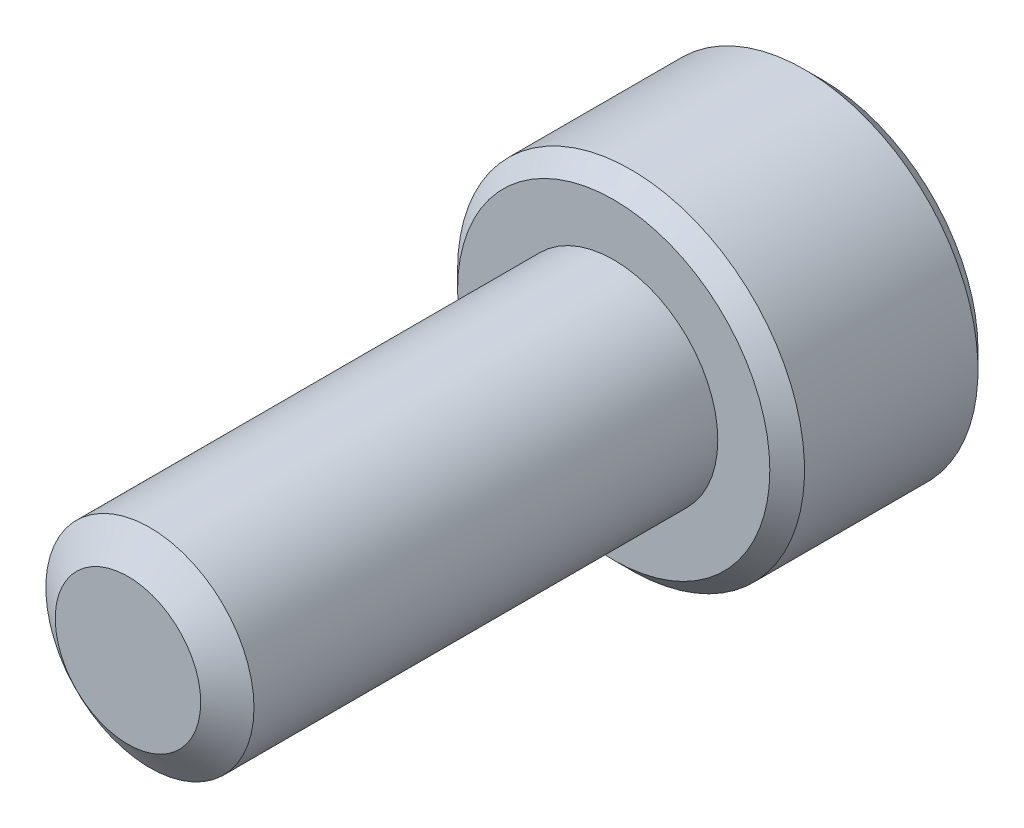
ISO-10303-21;
HEADER;
FILE_DESCRIPTION(('STEP AP214'),'2;1');
FILE_NAME('part.step','',(''),(''),'','','');
FILE_SCHEMA(('AUTOMOTIVE_DESIGN { 1 0 10303 214 1 1 1 1 }'));
ENDSEC;
DATA;
#1=APPLICATION_CONTEXT('core data for automotive mechanical design processes');
#2=APPLICATION_PROTOCOL_DEFINITION('international standard','automotive_design',2000,#1);
#3=PRODUCT_CONTEXT('',#1,'mechanical');
#4=PRODUCT('Part','Part','',(#3));
#5=PRODUCT_RELATED_PRODUCT_CATEGORY('part','',(#4));
#6=PRODUCT_DEFINITION_FORMATION('','',#4);
#7=PRODUCT_DEFINITION_CONTEXT('part definition',#1,'design');
#8=PRODUCT_DEFINITION('design','',#6,#7);
#9=PRODUCT_DEFINITION_SHAPE('','',#8);
#10=(LENGTH_UNIT() NAMED_UNIT(*) SI_UNIT(.MILLI.,.METRE.));
#11=(NAMED_UNIT(*) PLANE_ANGLE_UNIT() SI_UNIT($,.RADIAN.));
#12=(NAMED_UNIT(*) SI_UNIT($,.STERADIAN.) SOLID_ANGLE_UNIT());
#13=UNCERTAINTY_MEASURE_WITH_UNIT(LENGTH_MEASURE(1.E-05),#10,'distance_accuracy_value','');
#14=(GEOMETRIC_REPRESENTATION_CONTEXT(3) GLOBAL_UNCERTAINTY_ASSIGNED_CONTEXT((#13)) GLOBAL_UNIT_ASSIGNED_CONTEXT((#10,
#11,#12)) REPRESENTATION_CONTEXT('',''));
#15=CARTESIAN_POINT('',(0.,0.,0.));
#16=DIRECTION('',(0.,0.,1.));
#17=DIRECTION('',(1.,0.,0.));
#18=AXIS2_PLACEMENT_3D('',#15,#16,#17);
#19=CARTESIAN_POINT('',(0.,0.,-14.));
#20=DIRECTION('',(0.,0.,1.));
#21=DIRECTION('',(1.,0.,0.));
#22=AXIS2_PLACEMENT_3D('',#19,#20,#21);
#23=CYLINDRICAL_SURFACE('',#22,3.);
#24=CARTESIAN_POINT('',(0.,0.,-14.));
#25=DIRECTION('',(0.,0.,-1.));
#26=DIRECTION('',(-1.,0.,0.));
#27=AXIS2_PLACEMENT_3D('',#24,#25,#26);
#28=CIRCLE('',#27,3.);
#29=CARTESIAN_POINT('',(-3.,0.,-14.));
#30=VERTEX_POINT('',#29);
#31=EDGE_CURVE('E231',#30,#30,#28,.F.);
#32=ORIENTED_EDGE('',*,*,#31,.T.);
#33=EDGE_LOOP('',(#32));
#34=FACE_BOUND('',#33,.T.);
#35=CARTESIAN_POINT('',(0.,0.,-0.632650851713494));
#36=DIRECTION('',(0.,0.,1.));
#37=DIRECTION('',(1.,0.,0.));
#38=AXIS2_PLACEMENT_3D('',#35,#36,#37);
#39=CIRCLE('',#38,3.);
#40=CARTESIAN_POINT('',(3.,0.,-0.632650851713494));
#41=VERTEX_POINT('',#40);
#42=EDGE_CURVE('E116',#41,#41,#39,.T.);
#43=ORIENTED_EDGE('',*,*,#42,.F.);
#44=EDGE_LOOP('',(#43));
#45=FACE_BOUND('',#44,.T.);
#46=ADVANCED_FACE('F39',(#34,#45),#23,.T.);
#47=CARTESIAN_POINT('',(0.,0.,0.));
#48=DIRECTION('',(0.,0.,-1.));
#49=DIRECTION('',(-1.,0.,0.));
#50=AXIS2_PLACEMENT_3D('',#47,#48,#49);
#51=CONICAL_SURFACE('',#50,2.09648094716167,0.959931088596884);
#52=ORIENTED_EDGE('',*,*,#42,.T.);
#53=EDGE_LOOP('',(#52));
#54=FACE_BOUND('',#53,.T.);
#55=CARTESIAN_POINT('',(0.,0.,0.));
#56=DIRECTION('',(0.,0.,1.));
#57=DIRECTION('',(1.,0.,0.));
#58=AXIS2_PLACEMENT_3D('',#55,#56,#57);
#59=CIRCLE('',#58,2.09648094716167);
#60=CARTESIAN_POINT('',(2.09648094716167,0.,0.));
#61=VERTEX_POINT('',#60);
#62=EDGE_CURVE('E228',#61,#61,#59,.T.);
#63=ORIENTED_EDGE('',*,*,#62,.F.);
#64=EDGE_LOOP('',(#63));
#65=FACE_BOUND('',#64,.T.);
#66=ADVANCED_FACE('F211',(#54,#65),#51,.T.);
#67=CARTESIAN_POINT('',(0.,0.,0.));
#68=DIRECTION('',(0.,0.,1.));
#69=DIRECTION('',(1.,0.,0.));
#70=AXIS2_PLACEMENT_3D('',#67,#68,#69);
#71=PLANE('',#70);
#72=ORIENTED_EDGE('',*,*,#62,.T.);
#73=EDGE_LOOP('',(#72));
#74=FACE_BOUND('',#73,.T.);
#75=ADVANCED_FACE('F208',(#74),#71,.T.);
#76=CARTESIAN_POINT('',(0.,0.,-20.));
#77=DIRECTION('',(0.,0.,1.));
#78=DIRECTION('',(1.,0.,0.));
#79=AXIS2_PLACEMENT_3D('',#76,#77,#78);
#80=CYLINDRICAL_SURFACE('',#79,5.);
#81=CARTESIAN_POINT('',(0.,0.,-19.5));
#82=DIRECTION('',(0.,0.,-1.));
#83=DIRECTION('',(-1.,0.,0.));
#84=AXIS2_PLACEMENT_3D('',#81,#82,#83);
#85=CIRCLE('',#84,5.);
#86=CARTESIAN_POINT('',(-5.,0.,-19.5));
#87=VERTEX_POINT('',#86);
#88=EDGE_CURVE('E48',#87,#87,#85,.F.);
#89=ORIENTED_EDGE('',*,*,#88,.T.);
#90=EDGE_LOOP('',(#89));
#91=FACE_BOUND('',#90,.T.);
#92=CARTESIAN_POINT('',(0.,0.,-14.5));
#93=DIRECTION('',(0.,0.,-1.));
#94=DIRECTION('',(-1.,0.,0.));
#95=AXIS2_PLACEMENT_3D('',#92,#93,#94);
#96=CIRCLE('',#95,5.);
#97=CARTESIAN_POINT('',(-5.,0.,-14.5));
#98=VERTEX_POINT('',#97);
#99=EDGE_CURVE('E185',#98,#98,#96,.T.);
#100=ORIENTED_EDGE('',*,*,#99,.T.);
#101=EDGE_LOOP('',(#100));
#102=FACE_BOUND('',#101,.T.);
#103=ADVANCED_FACE('F192',(#91,#102),#80,.T.);
#104=CARTESIAN_POINT('',(0.,0.,-20.));
#105=DIRECTION('',(0.,0.,-1.));
#106=DIRECTION('',(-1.,0.,0.));
#107=AXIS2_PLACEMENT_3D('',#104,#105,#106);
#108=PLANE('',#107);
#109=CARTESIAN_POINT('',(0.,0.,-20.));
#110=DIRECTION('',(0.,0.,-1.));
#111=DIRECTION('',(-1.,0.,0.));
#112=AXIS2_PLACEMENT_3D('',#109,#110,#111);
#113=CIRCLE('',#112,4.5);
#114=CARTESIAN_POINT('',(-4.5,0.,-20.));
#115=VERTEX_POINT('',#114);
#116=EDGE_CURVE('E115',#115,#115,#113,.T.);
#117=ORIENTED_EDGE('',*,*,#116,.T.);
#118=EDGE_LOOP('',(#117));
#119=FACE_BOUND('',#118,.T.);
#120=CARTESIAN_POINT('',(0.,0.,-20.));
#121=DIRECTION('',(0.,0.,-1.));
#122=DIRECTION('',(-1.,0.,0.));
#123=AXIS2_PLACEMENT_3D('',#120,#121,#122);
#124=CIRCLE('',#123,2.88675134594813);
#125=CARTESIAN_POINT('',(-2.5,1.44337567297406,-20.));
#126=VERTEX_POINT('',#125);
#127=CARTESIAN_POINT('',(0.,2.88675134594813,-20.));
#128=VERTEX_POINT('',#127);
#129=EDGE_CURVE('E94',#126,#128,#124,.T.);
#130=ORIENTED_EDGE('',*,*,#129,.F.);
#131=CARTESIAN_POINT('',(-2.5,-1.44337567297406,-20.));
#132=VERTEX_POINT('',#131);
#133=EDGE_CURVE('E54',#132,#126,#124,.T.);
#134=ORIENTED_EDGE('',*,*,#133,.F.);
#135=CARTESIAN_POINT('',(0.,-2.88675134594813,-20.));
#136=VERTEX_POINT('',#135);
#137=EDGE_CURVE('E304',#136,#132,#124,.T.);
#138=ORIENTED_EDGE('',*,*,#137,.F.);
#139=CARTESIAN_POINT('',(2.5,-1.44337567297406,-20.));
#140=VERTEX_POINT('',#139);
#141=EDGE_CURVE('E61',#140,#136,#124,.T.);
#142=ORIENTED_EDGE('',*,*,#141,.F.);
#143=CARTESIAN_POINT('',(2.5,1.44337567297407,-20.));
#144=VERTEX_POINT('',#143);
#145=EDGE_CURVE('E139',#144,#140,#124,.T.);
#146=ORIENTED_EDGE('',*,*,#145,.F.);
#147=EDGE_CURVE('E104',#128,#144,#124,.T.);
#148=ORIENTED_EDGE('',*,*,#147,.F.);
#149=EDGE_LOOP('',(#130,#134,#138,#142,#146,#148));
#150=FACE_BOUND('',#149,.T.);
#151=ADVANCED_FACE('F138',(#119,#150),#108,.T.);
#152=CARTESIAN_POINT('',(0.,0.,-14.));
#153=DIRECTION('',(0.,0.,-1.));
#154=DIRECTION('',(-1.,0.,0.));
#155=AXIS2_PLACEMENT_3D('',#152,#153,#154);
#156=PLANE('',#155);
#157=CARTESIAN_POINT('',(0.,0.,-14.));
#158=DIRECTION('',(0.,0.,-1.));
#159=DIRECTION('',(-1.,0.,0.));
#160=AXIS2_PLACEMENT_3D('',#157,#158,#159);
#161=CIRCLE('',#160,4.5);
#162=CARTESIAN_POINT('',(-4.5,0.,-14.));
#163=VERTEX_POINT('',#162);
#164=EDGE_CURVE('E11',#163,#163,#161,.F.);
#165=ORIENTED_EDGE('',*,*,#164,.T.);
#166=EDGE_LOOP('',(#165));
#167=FACE_BOUND('',#166,.T.);
#168=ORIENTED_EDGE('',*,*,#31,.F.);
#169=EDGE_LOOP('',(#168));
#170=FACE_BOUND('',#169,.T.);
#171=ADVANCED_FACE('F201',(#167,#170),#156,.F.);
#172=CARTESIAN_POINT('',(0.,0.,-20.));
#173=DIRECTION('',(0.,0.,-1.));
#174=DIRECTION('',(-1.,0.,0.));
#175=AXIS2_PLACEMENT_3D('',#172,#173,#174);
#176=CONICAL_SURFACE('',#175,2.88675134594813,0.78539816339745);
#177=ORIENTED_EDGE('',*,*,#147,.T.);
#178=CARTESIAN_POINT('',(-0.000200000000000267,2.88686681600197,-20.0001154769818));
#179=CARTESIAN_POINT('',(0.0857382777877645,2.83725032818751,-19.9505407053547));
#180=CARTESIAN_POINT('',(0.173113567275753,2.7868041812811,-19.9038774813625));
#181=CARTESIAN_POINT('',(0.351281456165589,2.6839389026696,-19.8184381400383));
#182=CARTESIAN_POINT('',(0.442091000681075,2.6315099876986,-19.779709562406));
#183=CARTESIAN_POINT('',(0.625204123126921,2.52578957716234,-19.7133667038977));
#184=CARTESIAN_POINT('',(0.71746106452934,2.47252500720904,-19.6855856685309));
#185=CARTESIAN_POINT('',(0.904006008776286,2.3648232334321,-19.6427831759107));
#186=CARTESIAN_POINT('',(0.998288312566283,2.31038931995913,-19.6277297666713));
#187=CARTESIAN_POINT('',(1.16077825829185,2.21657570605387,-19.6141477222095));
#188=CARTESIAN_POINT('',(1.22877596788015,2.17731721011878,-19.6121370992408));
#189=CARTESIAN_POINT('',(1.36466024116922,2.0988643883567,-19.6155241171875));
#190=CARTESIAN_POINT('',(1.43254675755224,2.05967008984862,-19.6209243552998));
#191=CARTESIAN_POINT('',(1.56767878823611,1.98165157555715,-19.6388257884025));
#192=CARTESIAN_POINT('',(1.63492349975356,1.94282782326097,-19.6513349270465));
#193=CARTESIAN_POINT('',(1.7682501008182,1.86585167424616,-19.6827675019557));
#194=CARTESIAN_POINT('',(1.83433207909966,1.82769922629678,-19.7016904464968));
#195=CARTESIAN_POINT('',(2.00359634669126,1.72997445583858,-19.7578673614082));
#196=CARTESIAN_POINT('',(2.10572912222289,1.67100807039231,-19.7993558315962));
#197=CARTESIAN_POINT('',(2.25590641494051,1.58430317001562,-19.8693940467231));
#198=CARTESIAN_POINT('',(2.30539653988261,1.55573003305807,-19.8940022521161));
#199=CARTESIAN_POINT('',(2.40346006383885,1.49911303110426,-19.9454618867152));
#200=CARTESIAN_POINT('',(2.45203400349693,1.47106885396706,-19.9723119387794));
#201=CARTESIAN_POINT('',(2.5002,1.44326020292023,-20.0001154769818));
#202=B_SPLINE_CURVE_WITH_KNOTS('',3,(#178,#179,#180,#181,#182,#183,#184,#185,#186,#187,#188,
#189,#190,#191,#192,#193,#194,#195,#196,#197,#198,#199,#200,#201),.UNSPECIFIED.,.F.,.F.,(4,2,2,
2,2,2,2,2,2,2,2,4),(0.,0.333012085133925,0.667964518301399,0.9975970320433,1.32639954393844,
1.56169424147169,1.79707142102083,2.03271213522171,2.26833478775651,2.64260240809533,
2.82922877818864,3.01574133749025),.UNSPECIFIED.);
#203=EDGE_CURVE('E109',#128,#144,#202,.T.);
#204=ORIENTED_EDGE('',*,*,#203,.F.);
#205=EDGE_LOOP('',(#177,#204));
#206=FACE_BOUND('',#205,.T.);
#207=ADVANCED_FACE('F110',(#206),#176,.F.);
#208=ORIENTED_EDGE('',*,*,#145,.T.);
#209=CARTESIAN_POINT('',(2.5,-2.87868021616154,-20.9259641937847));
#210=CARTESIAN_POINT('',(2.5,-2.80858751756355,-20.8730547693995));
#211=CARTESIAN_POINT('',(2.5,-2.73810237384458,-20.8206567848064));
#212=CARTESIAN_POINT('',(2.5,-2.59619238907469,-20.7171126835152));
#213=CARTESIAN_POINT('',(2.5,-2.52476731657143,-20.6659668843779));
#214=CARTESIAN_POINT('',(2.5,-2.38030019419698,-20.5647924979814));
#215=CARTESIAN_POINT('',(2.5,-2.30724990359399,-20.5147756377845));
#216=CARTESIAN_POINT('',(2.5,-2.15990937397294,-20.4166088439155));
#217=CARTESIAN_POINT('',(2.5,-2.08561922308943,-20.3684587783455));
#218=CARTESIAN_POINT('',(2.5,-1.93130274871409,-20.271746559452));
#219=CARTESIAN_POINT('',(2.5,-1.8511916849785,-20.2233189325373));
#220=CARTESIAN_POINT('',(2.5,-1.68912282627168,-20.1296640597041));
#221=CARTESIAN_POINT('',(2.5,-1.60716527674864,-20.0844363916948));
#222=CARTESIAN_POINT('',(2.5,-1.44137668632319,-19.9981353746693));
#223=CARTESIAN_POINT('',(2.5,-1.35755175925796,-19.9570503726636));
#224=CARTESIAN_POINT('',(2.5,-1.18761577759421,-19.8799618661066));
#225=CARTESIAN_POINT('',(2.5,-1.10150577924729,-19.8439560607346));
#226=CARTESIAN_POINT('',(2.5,-0.933895283730373,-19.7809497442851));
#227=CARTESIAN_POINT('',(2.5,-0.852581486652412,-19.7534577201431));
#228=CARTESIAN_POINT('',(2.5,-0.687996185051426,-19.7049971144174));
#229=CARTESIAN_POINT('',(2.5,-0.604724546085163,-19.684028982239));
#230=CARTESIAN_POINT('',(2.5,-0.43810578650165,-19.650059995013));
#231=CARTESIAN_POINT('',(2.5,-0.354786957377882,-19.6369226334436));
#232=CARTESIAN_POINT('',(2.5,-0.187258638268772,-19.6188701943996));
#233=CARTESIAN_POINT('',(2.5,-0.103049303891733,-19.6139537035302));
#234=CARTESIAN_POINT('',(2.5,0.0623819458555491,-19.6127080743719));
#235=CARTESIAN_POINT('',(2.5,0.143601667742494,-19.6160745517109));
#236=CARTESIAN_POINT('',(2.5,0.305344840533964,-19.6305375923809));
#237=CARTESIAN_POINT('',(2.5,0.385868223029658,-19.6416349066531));
#238=CARTESIAN_POINT('',(2.5,0.546999992477731,-19.6711420785853));
#239=CARTESIAN_POINT('',(2.5,0.62758525815638,-19.6896763768309));
#240=CARTESIAN_POINT('',(2.5,0.786991930978587,-19.7330723320141));
#241=CARTESIAN_POINT('',(2.5,0.865813485110825,-19.7579334595174));
#242=CARTESIAN_POINT('',(2.5,1.11399280220491,-19.8455589112399));
#243=CARTESIAN_POINT('',(2.5,1.27984027529456,-19.9183033354746));
#244=CARTESIAN_POINT('',(2.5,1.52253018655038,-20.0395423452678));
#245=CARTESIAN_POINT('',(2.5,1.60256472908879,-20.0820714512072));
#246=CARTESIAN_POINT('',(2.5,1.76081489282125,-20.1703965241522));
#247=CARTESIAN_POINT('',(2.5,1.83903083842887,-20.2161919024767));
#248=CARTESIAN_POINT('',(2.5,1.99000684607168,-20.3080446787286));
#249=CARTESIAN_POINT('',(2.5,2.06284472030444,-20.3539756354245));
#250=CARTESIAN_POINT('',(2.5,2.20727164736135,-20.4477702453865));
#251=CARTESIAN_POINT('',(2.5,2.27886060500402,-20.4956340450436));
#252=CARTESIAN_POINT('',(2.5,2.42037078548403,-20.5925522363183));
#253=CARTESIAN_POINT('',(2.5,2.49030083172878,-20.6415937983162));
#254=CARTESIAN_POINT('',(2.5,2.62920524991558,-20.7409738351898));
#255=CARTESIAN_POINT('',(2.5,2.69817987937839,-20.7913119497074));
#256=CARTESIAN_POINT('',(2.5,2.76675463365823,-20.8421802976824));
#257=B_SPLINE_CURVE_WITH_KNOTS('',3,(#209,#210,#211,#212,#213,#214,#215,#216,#217,#218,#219,
#220,#221,#222,#223,#224,#225,#226,#227,#228,#229,#230,#231,#232,#233,#234,#235,#236,#237,#238,
#239,#240,#241,#242,#243,#244,#245,#246,#247,#248,#249,#250,#251,#252,#253,#254,#255,#256),
.UNSPECIFIED.,.F.,.F.,(4,2,2,2,2,2,2,2,2,2,2,2,2,2,2,2,2,2,2,2,2,2,2,4),(0.,0.263465914971117,
0.526997968323239,0.792571943279364,1.05812711983772,1.33890112548019,1.61963802629079,
1.89956181222216,2.17935838571897,2.436638876826,2.69393708705248,2.94660788173135,
3.19923523085016,3.44271854486786,3.68622551313359,3.93398926860573,4.18173229781968,
4.72334004841908,4.99521600382014,5.26704308216966,5.52534341671993,5.78366335141086,
6.03988492204047,6.29603603207541),.UNSPECIFIED.);
#258=EDGE_CURVE('E103',#144,#140,#257,.F.);
#259=ORIENTED_EDGE('',*,*,#258,.F.);
#260=EDGE_LOOP('',(#208,#259));
#261=FACE_BOUND('',#260,.T.);
#262=ADVANCED_FACE('F315',(#261),#176,.F.);
#263=ORIENTED_EDGE('',*,*,#141,.T.);
#264=CARTESIAN_POINT('',(2.5002,-1.44326020292023,-20.0001154769818));
#265=CARTESIAN_POINT('',(2.41426172221224,-1.49287669073469,-19.9505407053547));
#266=CARTESIAN_POINT('',(2.32688643272425,-1.5433228376411,-19.9038774813625));
#267=CARTESIAN_POINT('',(2.14871854383441,-1.64618811625259,-19.8184381400383));
#268=CARTESIAN_POINT('',(2.05790899931892,-1.6986170312236,-19.779709562406));
#269=CARTESIAN_POINT('',(1.87479587687308,-1.80433744175986,-19.7133667038977));
#270=CARTESIAN_POINT('',(1.78253893547066,-1.85760201171316,-19.6855856685309));
#271=CARTESIAN_POINT('',(1.59599399122371,-1.96530378549009,-19.6427831759107));
#272=CARTESIAN_POINT('',(1.50171168743372,-2.01973769896307,-19.6277297666713));
#273=CARTESIAN_POINT('',(1.33922174170815,-2.11355131286833,-19.6141477222095));
#274=CARTESIAN_POINT('',(1.27122403211985,-2.15280980880341,-19.6121370992408));
#275=CARTESIAN_POINT('',(1.13533975883078,-2.23126263056549,-19.6155241171875));
#276=CARTESIAN_POINT('',(1.06745324244776,-2.27045692907358,-19.6209243552998));
#277=CARTESIAN_POINT('',(0.932321211763892,-2.34847544336505,-19.6388257884025));
#278=CARTESIAN_POINT('',(0.865076500246438,-2.38729919566123,-19.6513349270465));
#279=CARTESIAN_POINT('',(0.731749899181799,-2.46427534467604,-19.6827675019557));
#280=CARTESIAN_POINT('',(0.665667920900341,-2.50242779262542,-19.7016904464968));
#281=CARTESIAN_POINT('',(0.496403653308733,-2.60015256308362,-19.7578673614082));
#282=CARTESIAN_POINT('',(0.394270877777106,-2.65911894852989,-19.7993558315962));
#283=CARTESIAN_POINT('',(0.244093585059491,-2.74582384890657,-19.8693940467231));
#284=CARTESIAN_POINT('',(0.194603460117391,-2.77439698586412,-19.8940022521161));
#285=CARTESIAN_POINT('',(0.0965399361611534,-2.83101398781794,-19.9454618867152));
#286=CARTESIAN_POINT('',(0.0479659965030722,-2.85905816495513,-19.9723119387794));
#287=CARTESIAN_POINT('',(-0.00019999999999949,-2.88686681600197,-20.0001154769818));
#288=B_SPLINE_CURVE_WITH_KNOTS('',3,(#264,#265,#266,#267,#268,#269,#270,#271,#272,#273,#274,
#275,#276,#277,#278,#279,#280,#281,#282,#283,#284,#285,#286,#287),.UNSPECIFIED.,.F.,.F.,(4,2,2,
2,2,2,2,2,2,2,2,4),(0.,0.333012085133925,0.6679645183014,0.997597032043303,1.32639954393845,
1.56169424147169,1.79707142102083,2.03271213522171,2.26833478775651,2.64260240809533,
2.82922877818864,3.01574133749025),.UNSPECIFIED.);
#289=EDGE_CURVE('E152',#140,#136,#288,.T.);
#290=ORIENTED_EDGE('',*,*,#289,.F.);
#291=EDGE_LOOP('',(#263,#290));
#292=FACE_BOUND('',#291,.T.);
#293=ADVANCED_FACE('F312',(#292),#176,.F.);
#294=ORIENTED_EDGE('',*,*,#137,.T.);
#295=CARTESIAN_POINT('',(0.000200000000000386,-2.88686681600197,-20.0001154769818));
#296=CARTESIAN_POINT('',(-0.0857382777877645,-2.83725032818751,-19.9505407053547));
#297=CARTESIAN_POINT('',(-0.173113567275753,-2.7868041812811,-19.9038774813625));
#298=CARTESIAN_POINT('',(-0.351281456165589,-2.6839389026696,-19.8184381400383));
#299=CARTESIAN_POINT('',(-0.442091000681075,-2.6315099876986,-19.779709562406));
#300=CARTESIAN_POINT('',(-0.625204123126922,-2.52578957716234,-19.7133667038977));
#301=CARTESIAN_POINT('',(-0.717461064529341,-2.47252500720904,-19.6855856685309));
#302=CARTESIAN_POINT('',(-0.904006008776286,-2.3648232334321,-19.6427831759107));
#303=CARTESIAN_POINT('',(-0.998288312566283,-2.31038931995913,-19.6277297666713));
#304=CARTESIAN_POINT('',(-1.16077825829185,-2.21657570605387,-19.6141477222095));
#305=CARTESIAN_POINT('',(-1.22877596788015,-2.17731721011878,-19.6121370992408));
#306=CARTESIAN_POINT('',(-1.36466024116922,-2.0988643883567,-19.6155241171875));
#307=CARTESIAN_POINT('',(-1.43254675755224,-2.05967008984862,-19.6209243552998));
#308=CARTESIAN_POINT('',(-1.56767878823611,-1.98165157555715,-19.6388257884025));
#309=CARTESIAN_POINT('',(-1.63492349975356,-1.94282782326097,-19.6513349270465));
#310=CARTESIAN_POINT('',(-1.7682501008182,-1.86585167424616,-19.6827675019557));
#311=CARTESIAN_POINT('',(-1.83433207909966,-1.82769922629678,-19.7016904464968));
#312=CARTESIAN_POINT('',(-2.00359634669126,-1.72997445583858,-19.7578673614082));
#313=CARTESIAN_POINT('',(-2.10572912222289,-1.67100807039231,-19.7993558315962));
#314=CARTESIAN_POINT('',(-2.25590641494051,-1.58430317001562,-19.8693940467231));
#315=CARTESIAN_POINT('',(-2.30539653988261,-1.55573003305807,-19.8940022521161));
#316=CARTESIAN_POINT('',(-2.40346006383885,-1.49911303110426,-19.9454618867152));
#317=CARTESIAN_POINT('',(-2.45203400349693,-1.47106885396706,-19.9723119387794));
#318=CARTESIAN_POINT('',(-2.5002,-1.44326020292023,-20.0001154769818));
#319=B_SPLINE_CURVE_WITH_KNOTS('',3,(#295,#296,#297,#298,#299,#300,#301,#302,#303,#304,#305,
#306,#307,#308,#309,#310,#311,#312,#313,#314,#315,#316,#317,#318),.UNSPECIFIED.,.F.,.F.,(4,2,2,
2,2,2,2,2,2,2,2,4),(0.,0.333012085133925,0.667964518301399,0.997597032043301,1.32639954393844,
1.56169424147169,1.79707142102083,2.03271213522171,2.26833478775651,2.64260240809533,
2.82922877818864,3.01574133749025),.UNSPECIFIED.);
#320=EDGE_CURVE('E281',#136,#132,#319,.T.);
#321=ORIENTED_EDGE('',*,*,#320,.F.);
#322=EDGE_LOOP('',(#294,#321));
#323=FACE_BOUND('',#322,.T.);
#324=ADVANCED_FACE('F309',(#323),#176,.F.);
#325=ORIENTED_EDGE('',*,*,#133,.T.);
#326=CARTESIAN_POINT('',(-2.5,-2.87868021658038,-20.9259641941009));
#327=CARTESIAN_POINT('',(-2.5,-2.80858751797063,-20.8730547697035));
#328=CARTESIAN_POINT('',(-2.5,-2.73810237423987,-20.8206567850983));
#329=CARTESIAN_POINT('',(-2.5,-2.59619238944629,-20.7171126837829));
#330=CARTESIAN_POINT('',(-2.5,-2.52476731693112,-20.6659668846335));
#331=CARTESIAN_POINT('',(-2.5,-2.38030019453246,-20.5647924982127));
#332=CARTESIAN_POINT('',(-2.5,-2.30724990391716,-20.5147756380036));
#333=CARTESIAN_POINT('',(-2.5,-2.15990937427125,-20.4166088441105));
#334=CARTESIAN_POINT('',(-2.5,-2.08561922337521,-20.3684587785285));
#335=CARTESIAN_POINT('',(-2.5,-1.93130274897283,-20.27174655961));
#336=CARTESIAN_POINT('',(-2.5,-1.85119168522271,-20.2233189326825));
#337=CARTESIAN_POINT('',(-2.5,-1.6891228264863,-20.1296640598241));
#338=CARTESIAN_POINT('',(-2.5,-1.60716527694822,-20.0844363918025));
#339=CARTESIAN_POINT('',(-2.5,-1.44137668649212,-19.9981353747534));
#340=CARTESIAN_POINT('',(-2.5,-1.3575517594113,-19.9570503727365));
#341=CARTESIAN_POINT('',(-2.5,-1.18761577771552,-19.8799618661583));
#342=CARTESIAN_POINT('',(-2.5,-1.10150577935218,-19.8439560607764));
#343=CARTESIAN_POINT('',(-2.5,-0.933895283828169,-19.7809497443196));
#344=CARTESIAN_POINT('',(-2.5,-0.852581486760257,-19.7534577201783));
#345=CARTESIAN_POINT('',(-2.5,-0.687996185179697,-19.7049971144518));
#346=CARTESIAN_POINT('',(-2.5,-0.60472454622381,-19.6840289822719));
#347=CARTESIAN_POINT('',(-2.5,-0.438105786660707,-19.6500599950408));
#348=CARTESIAN_POINT('',(-2.5,-0.354786957546969,-19.6369226334677));
#349=CARTESIAN_POINT('',(-2.5,-0.187258638457583,-19.6188701944141));
#350=CARTESIAN_POINT('',(-2.5,-0.103049304090238,-19.6139537035387));
#351=CARTESIAN_POINT('',(-2.5,0.0623819456391578,-19.6127080743668));
#352=CARTESIAN_POINT('',(-2.5,0.143601667517886,-19.6160745516982));
#353=CARTESIAN_POINT('',(-2.5,0.305344840293744,-19.630537592352));
#354=CARTESIAN_POINT('',(-2.5,0.385868222782043,-19.6416349066155));
#355=CARTESIAN_POINT('',(-2.5,0.546999992215518,-19.6711420785295));
#356=CARTESIAN_POINT('',(-2.5,0.627585257886985,-19.6896763767654));
#357=CARTESIAN_POINT('',(-2.5,0.786991930695524,-19.7330723319292));
#358=CARTESIAN_POINT('',(-2.5,0.865813484821273,-19.7579334594227));
#359=CARTESIAN_POINT('',(-2.5,1.1139928018523,-19.8455589110989));
#360=CARTESIAN_POINT('',(-2.5,1.27984027488853,-19.9183033352911));
#361=CARTESIAN_POINT('',(-2.5,1.52253018606745,-20.039542345017));
#362=CARTESIAN_POINT('',(-2.5,1.60256472858067,-20.0820714509332));
#363=CARTESIAN_POINT('',(-2.5,1.76081489226356,-20.1703965238313));
#364=CARTESIAN_POINT('',(-2.5,1.8390308378468,-20.216191902132));
#365=CARTESIAN_POINT('',(-2.5,1.99000684544531,-20.3080446783387));
#366=CARTESIAN_POINT('',(-2.5,2.06284471965806,-20.3539756350131));
#367=CARTESIAN_POINT('',(-2.5,2.20727164667524,-20.4477702449325));
#368=CARTESIAN_POINT('',(-2.5,2.27886060429818,-20.4956340445682));
#369=CARTESIAN_POINT('',(-2.5,2.42037078473922,-20.5925522358003));
#370=CARTESIAN_POINT('',(-2.5,2.49030083096472,-20.641593797777));
#371=CARTESIAN_POINT('',(-2.5,2.62920524911314,-20.7409738346083));
#372=CARTESIAN_POINT('',(-2.5,2.69817987855682,-20.7913119491048));
#373=CARTESIAN_POINT('',(-2.5,2.76675463281757,-20.8421802970587));
#374=B_SPLINE_CURVE_WITH_KNOTS('',3,(#326,#327,#328,#329,#330,#331,#332,#333,#334,#335,#336,
#337,#338,#339,#340,#341,#342,#343,#344,#345,#346,#347,#348,#349,#350,#351,#352,#353,#354,#355,
#356,#357,#358,#359,#360,#361,#362,#363,#364,#365,#366,#367,#368,#369,#370,#371,#372,#373),
.UNSPECIFIED.,.F.,.F.,(4,2,2,2,2,2,2,2,2,2,2,2,2,2,2,2,2,2,2,2,2,2,2,4),(0.,0.263465915021261,
0.526997968423546,0.792571943430778,1.05812712004023,1.33890112574002,1.61963802660793,
1.89956181259616,2.17935838614974,2.43663887722771,2.69393708742518,2.94660788207623,
3.19923523116722,3.44271854515946,3.6862255133997,3.9339892688444,4.18173229803092,
4.72334004843317,4.99521600373497,5.26704308198527,5.52534341645065,5.78366335105668,
6.03988492160254,6.29603603155374),.UNSPECIFIED.);
#375=EDGE_CURVE('E127',#132,#126,#374,.T.);
#376=ORIENTED_EDGE('',*,*,#375,.F.);
#377=EDGE_LOOP('',(#325,#376));
#378=FACE_BOUND('',#377,.T.);
#379=ADVANCED_FACE('F324',(#378),#176,.F.);
#380=ORIENTED_EDGE('',*,*,#129,.T.);
#381=CARTESIAN_POINT('',(-2.5002,1.44326020292023,-20.0001154769818));
#382=CARTESIAN_POINT('',(-2.41426172221224,1.49287669073469,-19.9505407053547));
#383=CARTESIAN_POINT('',(-2.32688643272425,1.5433228376411,-19.9038774813625));
#384=CARTESIAN_POINT('',(-2.14871854383441,1.64618811625259,-19.8184381400383));
#385=CARTESIAN_POINT('',(-2.05790899931892,1.69861703122359,-19.779709562406));
#386=CARTESIAN_POINT('',(-1.87479587687308,1.80433744175986,-19.7133667038977));
#387=CARTESIAN_POINT('',(-1.78253893547066,1.85760201171316,-19.6855856685309));
#388=CARTESIAN_POINT('',(-1.59599399122371,1.96530378549009,-19.6427831759107));
#389=CARTESIAN_POINT('',(-1.50171168743372,2.01973769896307,-19.6277297666713));
#390=CARTESIAN_POINT('',(-1.33922174170815,2.11355131286833,-19.6141477222095));
#391=CARTESIAN_POINT('',(-1.27122403211985,2.15280980880341,-19.6121370992408));
#392=CARTESIAN_POINT('',(-1.13533975883078,2.23126263056549,-19.6155241171875));
#393=CARTESIAN_POINT('',(-1.06745324244776,2.27045692907358,-19.6209243552998));
#394=CARTESIAN_POINT('',(-0.932321211763893,2.34847544336505,-19.6388257884025));
#395=CARTESIAN_POINT('',(-0.865076500246438,2.38729919566123,-19.6513349270465));
#396=CARTESIAN_POINT('',(-0.731749899181799,2.46427534467604,-19.6827675019557));
#397=CARTESIAN_POINT('',(-0.665667920900341,2.50242779262542,-19.7016904464968));
#398=CARTESIAN_POINT('',(-0.496403653308733,2.60015256308362,-19.7578673614082));
#399=CARTESIAN_POINT('',(-0.394270877777106,2.65911894852989,-19.7993558315962));
#400=CARTESIAN_POINT('',(-0.24409358505949,2.74582384890657,-19.8693940467231));
#401=CARTESIAN_POINT('',(-0.19460346011739,2.77439698586412,-19.8940022521161));
#402=CARTESIAN_POINT('',(-0.0965399361611523,2.83101398781794,-19.9454618867152));
#403=CARTESIAN_POINT('',(-0.0479659965030712,2.85905816495513,-19.9723119387794));
#404=CARTESIAN_POINT('',(0.000200000000000194,2.88686681600197,-20.0001154769818));
#405=B_SPLINE_CURVE_WITH_KNOTS('',3,(#381,#382,#383,#384,#385,#386,#387,#388,#389,#390,#391,
#392,#393,#394,#395,#396,#397,#398,#399,#400,#401,#402,#403,#404),.UNSPECIFIED.,.F.,.F.,(4,2,2,
2,2,2,2,2,2,2,2,4),(0.,0.333012085133926,0.6679645183014,0.997597032043302,1.32639954393845,
1.56169424147169,1.79707142102083,2.03271213522171,2.26833478775651,2.64260240809533,
2.82922877818864,3.01574133749025),.UNSPECIFIED.);
#406=EDGE_CURVE('E98',#126,#128,#405,.T.);
#407=ORIENTED_EDGE('',*,*,#406,.F.);
#408=EDGE_LOOP('',(#380,#407));
#409=FACE_BOUND('',#408,.T.);
#410=ADVANCED_FACE('F96',(#409),#176,.F.);
#411=CARTESIAN_POINT('',(2.5,4.33012701892219,-16.25));
#412=DIRECTION('',(0.,0.,-1.));
#413=DIRECTION('',(-1.,0.,0.));
#414=AXIS2_PLACEMENT_3D('',#411,#412,#413);
#415=PLANE('',#414);
#416=DIRECTION('',(0.866025403784439,0.5,0.));
#417=VECTOR('',#416,1.);
#418=CARTESIAN_POINT('',(-2.5,1.44337567297406,-16.25));
#419=LINE('',#418,#417);
#420=CARTESIAN_POINT('',(-2.5,1.44337567297406,-16.25));
#421=VERTEX_POINT('',#420);
#422=CARTESIAN_POINT('',(0.,2.88675134594813,-16.25));
#423=VERTEX_POINT('',#422);
#424=EDGE_CURVE('E126',#421,#423,#419,.T.);
#425=ORIENTED_EDGE('',*,*,#424,.T.);
#426=DIRECTION('',(0.866025403784439,-0.5,0.));
#427=VECTOR('',#426,1.);
#428=CARTESIAN_POINT('',(0.,2.88675134594813,-16.25));
#429=LINE('',#428,#427);
#430=CARTESIAN_POINT('',(2.5,1.44337567297406,-16.25));
#431=VERTEX_POINT('',#430);
#432=EDGE_CURVE('E131',#423,#431,#429,.T.);
#433=ORIENTED_EDGE('',*,*,#432,.T.);
#434=DIRECTION('',(0.,-1.,0.));
#435=VECTOR('',#434,1.);
#436=CARTESIAN_POINT('',(2.5,1.44337567297406,-16.25));
#437=LINE('',#436,#435);
#438=CARTESIAN_POINT('',(2.5,-1.44337567297407,-16.25));
#439=VERTEX_POINT('',#438);
#440=EDGE_CURVE('E263',#431,#439,#437,.T.);
#441=ORIENTED_EDGE('',*,*,#440,.T.);
#442=DIRECTION('',(-0.866025403784439,-0.5,0.));
#443=VECTOR('',#442,1.);
#444=CARTESIAN_POINT('',(2.5,-1.44337567297407,-16.25));
#445=LINE('',#444,#443);
#446=CARTESIAN_POINT('',(0.,-2.88675134594813,-16.25));
#447=VERTEX_POINT('',#446);
#448=EDGE_CURVE('E259',#439,#447,#445,.T.);
#449=ORIENTED_EDGE('',*,*,#448,.T.);
#450=DIRECTION('',(-0.866025403784439,0.5,0.));
#451=VECTOR('',#450,1.);
#452=CARTESIAN_POINT('',(0.,-2.88675134594813,-16.25));
#453=LINE('',#452,#451);
#454=CARTESIAN_POINT('',(-2.5,-1.44337567297406,-16.25));
#455=VERTEX_POINT('',#454);
#456=EDGE_CURVE('E255',#447,#455,#453,.T.);
#457=ORIENTED_EDGE('',*,*,#456,.T.);
#458=DIRECTION('',(0.,1.,0.));
#459=VECTOR('',#458,1.);
#460=CARTESIAN_POINT('',(-2.5,-1.44337567297406,-16.25));
#461=LINE('',#460,#459);
#462=EDGE_CURVE('E135',#455,#421,#461,.T.);
#463=ORIENTED_EDGE('',*,*,#462,.T.);
#464=EDGE_LOOP('',(#425,#433,#441,#449,#457,#463));
#465=FACE_BOUND('',#464,.T.);
#466=ADVANCED_FACE('F172',(#465),#415,.T.);
#467=CARTESIAN_POINT('',(0.,2.88675134594813,-16.25));
#468=DIRECTION('',(0.5,0.866025403784439,0.));
#469=DIRECTION('',(-0.866025403784439,0.5,0.));
#470=AXIS2_PLACEMENT_3D('',#467,#468,#469);
#471=PLANE('',#470);
#472=DIRECTION('',(0.,0.,-1.));
#473=VECTOR('',#472,1.);
#474=CARTESIAN_POINT('',(0.,2.88675134594813,-16.25));
#475=LINE('',#474,#473);
#476=EDGE_CURVE('E122',#423,#128,#475,.T.);
#477=ORIENTED_EDGE('',*,*,#476,.T.);
#478=ORIENTED_EDGE('',*,*,#203,.T.);
#479=DIRECTION('',(0.,0.,-1.));
#480=VECTOR('',#479,1.);
#481=CARTESIAN_POINT('',(2.5,1.44337567297406,-16.25));
#482=LINE('',#481,#480);
#483=EDGE_CURVE('E134',#431,#144,#482,.T.);
#484=ORIENTED_EDGE('',*,*,#483,.F.);
#485=ORIENTED_EDGE('',*,*,#432,.F.);
#486=EDGE_LOOP('',(#477,#478,#484,#485));
#487=FACE_BOUND('',#486,.T.);
#488=ADVANCED_FACE('F129',(#487),#471,.F.);
#489=CARTESIAN_POINT('',(2.5,1.44337567297406,-16.25));
#490=DIRECTION('',(1.,0.,0.));
#491=DIRECTION('',(0.,0.,-1.));
#492=AXIS2_PLACEMENT_3D('',#489,#490,#491);
#493=PLANE('',#492);
#494=ORIENTED_EDGE('',*,*,#483,.T.);
#495=ORIENTED_EDGE('',*,*,#258,.T.);
#496=DIRECTION('',(0.,0.,-1.));
#497=VECTOR('',#496,1.);
#498=CARTESIAN_POINT('',(2.5,-1.44337567297407,-16.25));
#499=LINE('',#498,#497);
#500=EDGE_CURVE('E239',#439,#140,#499,.T.);
#501=ORIENTED_EDGE('',*,*,#500,.F.);
#502=ORIENTED_EDGE('',*,*,#440,.F.);
#503=EDGE_LOOP('',(#494,#495,#501,#502));
#504=FACE_BOUND('',#503,.T.);
#505=ADVANCED_FACE('F161',(#504),#493,.F.);
#506=CARTESIAN_POINT('',(2.5,-1.44337567297407,-16.25));
#507=DIRECTION('',(0.5,-0.866025403784439,0.));
#508=DIRECTION('',(0.866025403784439,0.5,0.));
#509=AXIS2_PLACEMENT_3D('',#506,#507,#508);
#510=PLANE('',#509);
#511=ORIENTED_EDGE('',*,*,#500,.T.);
#512=ORIENTED_EDGE('',*,*,#289,.T.);
#513=DIRECTION('',(0.,0.,-1.));
#514=VECTOR('',#513,1.);
#515=CARTESIAN_POINT('',(0.,-2.88675134594813,-16.25));
#516=LINE('',#515,#514);
#517=EDGE_CURVE('E243',#447,#136,#516,.T.);
#518=ORIENTED_EDGE('',*,*,#517,.F.);
#519=ORIENTED_EDGE('',*,*,#448,.F.);
#520=EDGE_LOOP('',(#511,#512,#518,#519));
#521=FACE_BOUND('',#520,.T.);
#522=ADVANCED_FACE('F165',(#521),#510,.F.);
#523=CARTESIAN_POINT('',(0.,-2.88675134594813,-16.25));
#524=DIRECTION('',(-0.5,-0.866025403784439,0.));
#525=DIRECTION('',(0.866025403784439,-0.5,0.));
#526=AXIS2_PLACEMENT_3D('',#523,#524,#525);
#527=PLANE('',#526);
#528=ORIENTED_EDGE('',*,*,#517,.T.);
#529=ORIENTED_EDGE('',*,*,#320,.T.);
#530=DIRECTION('',(0.,0.,-1.));
#531=VECTOR('',#530,1.);
#532=CARTESIAN_POINT('',(-2.5,-1.44337567297406,-16.25));
#533=LINE('',#532,#531);
#534=EDGE_CURVE('E247',#455,#132,#533,.T.);
#535=ORIENTED_EDGE('',*,*,#534,.F.);
#536=ORIENTED_EDGE('',*,*,#456,.F.);
#537=EDGE_LOOP('',(#528,#529,#535,#536));
#538=FACE_BOUND('',#537,.T.);
#539=ADVANCED_FACE('F289',(#538),#527,.F.);
#540=CARTESIAN_POINT('',(-2.5,-1.44337567297406,-16.25));
#541=DIRECTION('',(-1.,0.,0.));
#542=DIRECTION('',(0.,-1.,0.));
#543=AXIS2_PLACEMENT_3D('',#540,#541,#542);
#544=PLANE('',#543);
#545=ORIENTED_EDGE('',*,*,#534,.T.);
#546=ORIENTED_EDGE('',*,*,#375,.T.);
#547=DIRECTION('',(0.,0.,-1.));
#548=VECTOR('',#547,1.);
#549=CARTESIAN_POINT('',(-2.5,1.44337567297406,-16.25));
#550=LINE('',#549,#548);
#551=EDGE_CURVE('E124',#421,#126,#550,.T.);
#552=ORIENTED_EDGE('',*,*,#551,.F.);
#553=ORIENTED_EDGE('',*,*,#462,.F.);
#554=EDGE_LOOP('',(#545,#546,#552,#553));
#555=FACE_BOUND('',#554,.T.);
#556=ADVANCED_FACE('F286',(#555),#544,.F.);
#557=CARTESIAN_POINT('',(-2.5,1.44337567297406,-16.25));
#558=DIRECTION('',(-0.5,0.866025403784439,0.));
#559=DIRECTION('',(-0.866025403784439,-0.5,0.));
#560=AXIS2_PLACEMENT_3D('',#557,#558,#559);
#561=PLANE('',#560);
#562=ORIENTED_EDGE('',*,*,#551,.T.);
#563=ORIENTED_EDGE('',*,*,#406,.T.);
#564=ORIENTED_EDGE('',*,*,#476,.F.);
#565=ORIENTED_EDGE('',*,*,#424,.F.);
#566=EDGE_LOOP('',(#562,#563,#564,#565));
#567=FACE_BOUND('',#566,.T.);
#568=ADVANCED_FACE('F120',(#567),#561,.F.);
#569=CARTESIAN_POINT('',(0.,0.,-20.));
#570=DIRECTION('',(0.,0.,1.));
#571=DIRECTION('',(1.,0.,0.));
#572=AXIS2_PLACEMENT_3D('',#569,#570,#571);
#573=CONICAL_SURFACE('',#572,4.5,0.785398163397444);
#574=ORIENTED_EDGE('',*,*,#88,.F.);
#575=EDGE_LOOP('',(#574));
#576=FACE_BOUND('',#575,.T.);
#577=ORIENTED_EDGE('',*,*,#116,.F.);
#578=EDGE_LOOP('',(#577));
#579=FACE_BOUND('',#578,.T.);
#580=ADVANCED_FACE('F195',(#576,#579),#573,.T.);
#581=CARTESIAN_POINT('',(0.,0.,-14.5));
#582=DIRECTION('',(0.,0.,-1.));
#583=DIRECTION('',(-1.,0.,0.));
#584=AXIS2_PLACEMENT_3D('',#581,#582,#583);
#585=CONICAL_SURFACE('',#584,5.,0.785398163397449);
#586=ORIENTED_EDGE('',*,*,#164,.F.);
#587=EDGE_LOOP('',(#586));
#588=FACE_BOUND('',#587,.T.);
#589=ORIENTED_EDGE('',*,*,#99,.F.);
#590=EDGE_LOOP('',(#589));
#591=FACE_BOUND('',#590,.T.);
#592=ADVANCED_FACE('F41',(#588,#591),#585,.T.);
#593=CLOSED_SHELL('',(#46,#66,#75,#103,#151,#171,#207,#262,#293,#324,#379,#410,#466,#488,#505,
#522,#539,#556,#568,#580,#592));
#594=MANIFOLD_SOLID_BREP('B2',#593);
#595=ADVANCED_BREP_SHAPE_REPRESENTATION('',(#18,#594),#14);
#596=SHAPE_DEFINITION_REPRESENTATION(#9,#595);
ENDSEC;
END-ISO-10303-21;
